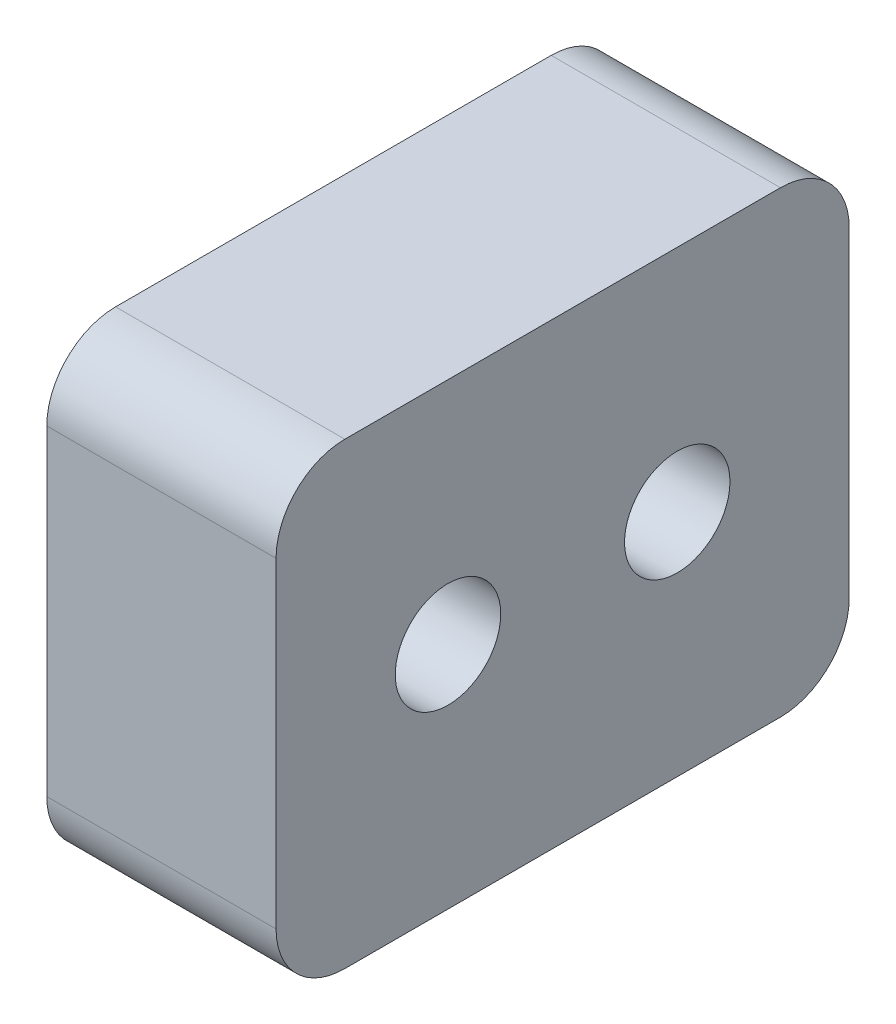
ISO-10303-21;
HEADER;
FILE_DESCRIPTION(('STEP AP214'),'2;1');
FILE_NAME('part.step','',(''),(''),'','','');
FILE_SCHEMA(('AUTOMOTIVE_DESIGN { 1 0 10303 214 1 1 1 1 }'));
ENDSEC;
DATA;
#1=APPLICATION_CONTEXT('core data for automotive mechanical design processes');
#2=APPLICATION_PROTOCOL_DEFINITION('international standard','automotive_design',2000,#1);
#3=PRODUCT_CONTEXT('',#1,'mechanical');
#4=PRODUCT('Part','Part','',(#3));
#5=PRODUCT_RELATED_PRODUCT_CATEGORY('part','',(#4));
#6=PRODUCT_DEFINITION_FORMATION('','',#4);
#7=PRODUCT_DEFINITION_CONTEXT('part definition',#1,'design');
#8=PRODUCT_DEFINITION('design','',#6,#7);
#9=PRODUCT_DEFINITION_SHAPE('','',#8);
#10=(LENGTH_UNIT() NAMED_UNIT(*) SI_UNIT(.MILLI.,.METRE.));
#11=(NAMED_UNIT(*) PLANE_ANGLE_UNIT() SI_UNIT($,.RADIAN.));
#12=(NAMED_UNIT(*) SI_UNIT($,.STERADIAN.) SOLID_ANGLE_UNIT());
#13=UNCERTAINTY_MEASURE_WITH_UNIT(LENGTH_MEASURE(1.E-05),#10,'distance_accuracy_value','');
#14=(GEOMETRIC_REPRESENTATION_CONTEXT(3) GLOBAL_UNCERTAINTY_ASSIGNED_CONTEXT((#13)) GLOBAL_UNIT_ASSIGNED_CONTEXT((#10,
#11,#12)) REPRESENTATION_CONTEXT('',''));
#15=CARTESIAN_POINT('',(0.,0.,0.));
#16=DIRECTION('',(0.,0.,1.));
#17=DIRECTION('',(1.,0.,0.));
#18=AXIS2_PLACEMENT_3D('',#15,#16,#17);
#19=CARTESIAN_POINT('',(10.,0.,0.));
#20=DIRECTION('',(-1.,0.,0.));
#21=DIRECTION('',(0.,0.,1.));
#22=AXIS2_PLACEMENT_3D('',#19,#20,#21);
#23=PLANE('',#22);
#24=DIRECTION('',(0.,-1.,0.));
#25=VECTOR('',#24,1.);
#26=CARTESIAN_POINT('',(10.,0.,0.));
#27=LINE('',#26,#25);
#28=CARTESIAN_POINT('',(10.,17.,0.));
#29=VERTEX_POINT('',#28);
#30=CARTESIAN_POINT('',(10.,3.,0.));
#31=VERTEX_POINT('',#30);
#32=EDGE_CURVE('E155',#29,#31,#27,.T.);
#33=ORIENTED_EDGE('',*,*,#32,.T.);
#34=CARTESIAN_POINT('',(10.,3.,-3.));
#35=DIRECTION('',(-1.,0.,0.));
#36=DIRECTION('',(0.,0.,1.));
#37=AXIS2_PLACEMENT_3D('',#34,#35,#36);
#38=CIRCLE('',#37,3.);
#39=CARTESIAN_POINT('',(10.,0.,-3.));
#40=VERTEX_POINT('',#39);
#41=EDGE_CURVE('E178',#31,#40,#38,.F.);
#42=ORIENTED_EDGE('',*,*,#41,.T.);
#43=DIRECTION('',(0.,0.,-1.));
#44=VECTOR('',#43,1.);
#45=CARTESIAN_POINT('',(10.,0.,0.));
#46=LINE('',#45,#44);
#47=CARTESIAN_POINT('',(10.,0.,-22.));
#48=VERTEX_POINT('',#47);
#49=EDGE_CURVE('E131',#40,#48,#46,.T.);
#50=ORIENTED_EDGE('',*,*,#49,.T.);
#51=CARTESIAN_POINT('',(10.,3.,-22.));
#52=DIRECTION('',(-1.,0.,0.));
#53=DIRECTION('',(0.,0.,1.));
#54=AXIS2_PLACEMENT_3D('',#51,#52,#53);
#55=CIRCLE('',#54,3.);
#56=CARTESIAN_POINT('',(10.,3.,-25.));
#57=VERTEX_POINT('',#56);
#58=EDGE_CURVE('E172',#48,#57,#55,.F.);
#59=ORIENTED_EDGE('',*,*,#58,.T.);
#60=DIRECTION('',(0.,1.,0.));
#61=VECTOR('',#60,1.);
#62=CARTESIAN_POINT('',(10.,0.,-25.));
#63=LINE('',#62,#61);
#64=CARTESIAN_POINT('',(10.,17.,-25.));
#65=VERTEX_POINT('',#64);
#66=EDGE_CURVE('E191',#57,#65,#63,.T.);
#67=ORIENTED_EDGE('',*,*,#66,.T.);
#68=CARTESIAN_POINT('',(10.,17.,-22.));
#69=DIRECTION('',(-1.,0.,0.));
#70=DIRECTION('',(0.,0.,1.));
#71=AXIS2_PLACEMENT_3D('',#68,#69,#70);
#72=CIRCLE('',#71,3.);
#73=CARTESIAN_POINT('',(10.,20.,-22.));
#74=VERTEX_POINT('',#73);
#75=EDGE_CURVE('E65',#65,#74,#72,.F.);
#76=ORIENTED_EDGE('',*,*,#75,.T.);
#77=DIRECTION('',(0.,0.,1.));
#78=VECTOR('',#77,1.);
#79=CARTESIAN_POINT('',(10.,20.,0.));
#80=LINE('',#79,#78);
#81=CARTESIAN_POINT('',(10.,20.,-3.));
#82=VERTEX_POINT('',#81);
#83=EDGE_CURVE('E157',#74,#82,#80,.T.);
#84=ORIENTED_EDGE('',*,*,#83,.T.);
#85=CARTESIAN_POINT('',(10.,17.,-3.));
#86=DIRECTION('',(-1.,0.,0.));
#87=DIRECTION('',(0.,0.,1.));
#88=AXIS2_PLACEMENT_3D('',#85,#86,#87);
#89=CIRCLE('',#88,3.);
#90=EDGE_CURVE('E175',#82,#29,#89,.F.);
#91=ORIENTED_EDGE('',*,*,#90,.T.);
#92=EDGE_LOOP('',(#33,#42,#50,#59,#67,#76,#84,#91));
#93=FACE_BOUND('',#92,.T.);
#94=CARTESIAN_POINT('',(10.,10.,-7.5));
#95=DIRECTION('',(1.,0.,0.));
#96=DIRECTION('',(0.,0.,-1.));
#97=AXIS2_PLACEMENT_3D('',#94,#95,#96);
#98=CIRCLE('',#97,2.3);
#99=CARTESIAN_POINT('',(10.,10.,-9.8));
#100=VERTEX_POINT('',#99);
#101=EDGE_CURVE('E149',#100,#100,#98,.T.);
#102=ORIENTED_EDGE('',*,*,#101,.F.);
#103=EDGE_LOOP('',(#102));
#104=FACE_BOUND('',#103,.T.);
#105=CARTESIAN_POINT('',(10.,10.,-17.5));
#106=DIRECTION('',(1.,0.,0.));
#107=DIRECTION('',(0.,0.,-1.));
#108=AXIS2_PLACEMENT_3D('',#105,#106,#107);
#109=CIRCLE('',#108,2.3);
#110=CARTESIAN_POINT('',(10.,10.,-19.8));
#111=VERTEX_POINT('',#110);
#112=EDGE_CURVE('E219',#111,#111,#109,.T.);
#113=ORIENTED_EDGE('',*,*,#112,.F.);
#114=EDGE_LOOP('',(#113));
#115=FACE_BOUND('',#114,.T.);
#116=ADVANCED_FACE('F42',(#93,#104,#115),#23,.F.);
#117=CARTESIAN_POINT('',(0.,0.,0.));
#118=DIRECTION('',(-1.,0.,0.));
#119=DIRECTION('',(0.,0.,1.));
#120=AXIS2_PLACEMENT_3D('',#117,#118,#119);
#121=PLANE('',#120);
#122=CARTESIAN_POINT('',(0.,10.,-7.5));
#123=DIRECTION('',(1.,0.,0.));
#124=DIRECTION('',(0.,0.,-1.));
#125=AXIS2_PLACEMENT_3D('',#122,#123,#124);
#126=CIRCLE('',#125,2.3);
#127=CARTESIAN_POINT('',(0.,10.,-9.8));
#128=VERTEX_POINT('',#127);
#129=EDGE_CURVE('E214',#128,#128,#126,.T.);
#130=ORIENTED_EDGE('',*,*,#129,.T.);
#131=EDGE_LOOP('',(#130));
#132=FACE_BOUND('',#131,.T.);
#133=DIRECTION('',(0.,0.,-1.));
#134=VECTOR('',#133,1.);
#135=CARTESIAN_POINT('',(0.,0.,0.));
#136=LINE('',#135,#134);
#137=CARTESIAN_POINT('',(0.,0.,-3.));
#138=VERTEX_POINT('',#137);
#139=CARTESIAN_POINT('',(0.,0.,-22.));
#140=VERTEX_POINT('',#139);
#141=EDGE_CURVE('E128',#138,#140,#136,.T.);
#142=ORIENTED_EDGE('',*,*,#141,.F.);
#143=CARTESIAN_POINT('',(0.,3.,-3.));
#144=DIRECTION('',(-1.,0.,0.));
#145=DIRECTION('',(0.,0.,1.));
#146=AXIS2_PLACEMENT_3D('',#143,#144,#145);
#147=CIRCLE('',#146,3.);
#148=CARTESIAN_POINT('',(0.,3.,0.));
#149=VERTEX_POINT('',#148);
#150=EDGE_CURVE('E110',#138,#149,#147,.T.);
#151=ORIENTED_EDGE('',*,*,#150,.T.);
#152=DIRECTION('',(0.,-1.,0.));
#153=VECTOR('',#152,1.);
#154=CARTESIAN_POINT('',(0.,0.,0.));
#155=LINE('',#154,#153);
#156=CARTESIAN_POINT('',(0.,17.,0.));
#157=VERTEX_POINT('',#156);
#158=EDGE_CURVE('E142',#157,#149,#155,.T.);
#159=ORIENTED_EDGE('',*,*,#158,.F.);
#160=CARTESIAN_POINT('',(0.,17.,-3.));
#161=DIRECTION('',(-1.,0.,0.));
#162=DIRECTION('',(0.,0.,1.));
#163=AXIS2_PLACEMENT_3D('',#160,#161,#162);
#164=CIRCLE('',#163,3.);
#165=CARTESIAN_POINT('',(0.,20.,-3.));
#166=VERTEX_POINT('',#165);
#167=EDGE_CURVE('E122',#157,#166,#164,.T.);
#168=ORIENTED_EDGE('',*,*,#167,.T.);
#169=DIRECTION('',(0.,0.,1.));
#170=VECTOR('',#169,1.);
#171=CARTESIAN_POINT('',(0.,20.,0.));
#172=LINE('',#171,#170);
#173=CARTESIAN_POINT('',(0.,20.,-22.));
#174=VERTEX_POINT('',#173);
#175=EDGE_CURVE('E147',#174,#166,#172,.T.);
#176=ORIENTED_EDGE('',*,*,#175,.F.);
#177=CARTESIAN_POINT('',(0.,17.,-22.));
#178=DIRECTION('',(-1.,0.,0.));
#179=DIRECTION('',(0.,0.,1.));
#180=AXIS2_PLACEMENT_3D('',#177,#178,#179);
#181=CIRCLE('',#180,3.);
#182=CARTESIAN_POINT('',(0.,17.,-25.));
#183=VERTEX_POINT('',#182);
#184=EDGE_CURVE('E133',#174,#183,#181,.T.);
#185=ORIENTED_EDGE('',*,*,#184,.T.);
#186=DIRECTION('',(0.,1.,0.));
#187=VECTOR('',#186,1.);
#188=CARTESIAN_POINT('',(0.,0.,-25.));
#189=LINE('',#188,#187);
#190=CARTESIAN_POINT('',(0.,3.,-25.));
#191=VERTEX_POINT('',#190);
#192=EDGE_CURVE('E141',#191,#183,#189,.T.);
#193=ORIENTED_EDGE('',*,*,#192,.F.);
#194=CARTESIAN_POINT('',(0.,3.,-22.));
#195=DIRECTION('',(-1.,0.,0.));
#196=DIRECTION('',(0.,0.,1.));
#197=AXIS2_PLACEMENT_3D('',#194,#195,#196);
#198=CIRCLE('',#197,3.);
#199=EDGE_CURVE('E139',#191,#140,#198,.T.);
#200=ORIENTED_EDGE('',*,*,#199,.T.);
#201=EDGE_LOOP('',(#142,#151,#159,#168,#176,#185,#193,#200));
#202=FACE_BOUND('',#201,.T.);
#203=CARTESIAN_POINT('',(0.,10.,-17.5));
#204=DIRECTION('',(1.,0.,0.));
#205=DIRECTION('',(0.,0.,-1.));
#206=AXIS2_PLACEMENT_3D('',#203,#204,#205);
#207=CIRCLE('',#206,2.3);
#208=CARTESIAN_POINT('',(0.,10.,-19.8));
#209=VERTEX_POINT('',#208);
#210=EDGE_CURVE('E223',#209,#209,#207,.T.);
#211=ORIENTED_EDGE('',*,*,#210,.T.);
#212=EDGE_LOOP('',(#211));
#213=FACE_BOUND('',#212,.T.);
#214=ADVANCED_FACE('F136',(#132,#202,#213),#121,.T.);
#215=CARTESIAN_POINT('',(10.,0.,0.));
#216=DIRECTION('',(0.,0.,-1.));
#217=DIRECTION('',(-1.,0.,0.));
#218=AXIS2_PLACEMENT_3D('',#215,#216,#217);
#219=PLANE('',#218);
#220=ORIENTED_EDGE('',*,*,#158,.T.);
#221=DIRECTION('',(-1.,0.,0.));
#222=VECTOR('',#221,1.);
#223=CARTESIAN_POINT('',(10.,3.,0.));
#224=LINE('',#223,#222);
#225=EDGE_CURVE('E115',#149,#31,#224,.F.);
#226=ORIENTED_EDGE('',*,*,#225,.T.);
#227=ORIENTED_EDGE('',*,*,#32,.F.);
#228=DIRECTION('',(-1.,0.,0.));
#229=VECTOR('',#228,1.);
#230=CARTESIAN_POINT('',(10.,17.,0.));
#231=LINE('',#230,#229);
#232=EDGE_CURVE('E121',#29,#157,#231,.T.);
#233=ORIENTED_EDGE('',*,*,#232,.T.);
#234=EDGE_LOOP('',(#220,#226,#227,#233));
#235=FACE_BOUND('',#234,.T.);
#236=ADVANCED_FACE('F208',(#235),#219,.F.);
#237=CARTESIAN_POINT('',(10.,0.,0.));
#238=DIRECTION('',(0.,1.,0.));
#239=DIRECTION('',(0.,0.,1.));
#240=AXIS2_PLACEMENT_3D('',#237,#238,#239);
#241=PLANE('',#240);
#242=ORIENTED_EDGE('',*,*,#49,.F.);
#243=DIRECTION('',(-1.,0.,0.));
#244=VECTOR('',#243,1.);
#245=CARTESIAN_POINT('',(10.,0.,-3.));
#246=LINE('',#245,#244);
#247=EDGE_CURVE('E114',#40,#138,#246,.T.);
#248=ORIENTED_EDGE('',*,*,#247,.T.);
#249=ORIENTED_EDGE('',*,*,#141,.T.);
#250=DIRECTION('',(-1.,0.,0.));
#251=VECTOR('',#250,1.);
#252=CARTESIAN_POINT('',(10.,0.,-22.));
#253=LINE('',#252,#251);
#254=EDGE_CURVE('E134',#140,#48,#253,.F.);
#255=ORIENTED_EDGE('',*,*,#254,.T.);
#256=EDGE_LOOP('',(#242,#248,#249,#255));
#257=FACE_BOUND('',#256,.T.);
#258=ADVANCED_FACE('F127',(#257),#241,.F.);
#259=CARTESIAN_POINT('',(10.,0.,-25.));
#260=DIRECTION('',(0.,0.,1.));
#261=DIRECTION('',(1.,0.,0.));
#262=AXIS2_PLACEMENT_3D('',#259,#260,#261);
#263=PLANE('',#262);
#264=ORIENTED_EDGE('',*,*,#66,.F.);
#265=DIRECTION('',(-1.,0.,0.));
#266=VECTOR('',#265,1.);
#267=CARTESIAN_POINT('',(10.,3.,-25.));
#268=LINE('',#267,#266);
#269=EDGE_CURVE('E11',#57,#191,#268,.T.);
#270=ORIENTED_EDGE('',*,*,#269,.T.);
#271=ORIENTED_EDGE('',*,*,#192,.T.);
#272=DIRECTION('',(-1.,0.,0.));
#273=VECTOR('',#272,1.);
#274=CARTESIAN_POINT('',(10.,17.,-25.));
#275=LINE('',#274,#273);
#276=EDGE_CURVE('E51',#183,#65,#275,.F.);
#277=ORIENTED_EDGE('',*,*,#276,.T.);
#278=EDGE_LOOP('',(#264,#270,#271,#277));
#279=FACE_BOUND('',#278,.T.);
#280=ADVANCED_FACE('F190',(#279),#263,.F.);
#281=CARTESIAN_POINT('',(10.,20.,0.));
#282=DIRECTION('',(0.,-1.,0.));
#283=DIRECTION('',(0.,0.,-1.));
#284=AXIS2_PLACEMENT_3D('',#281,#282,#283);
#285=PLANE('',#284);
#286=ORIENTED_EDGE('',*,*,#175,.T.);
#287=DIRECTION('',(-1.,0.,0.));
#288=VECTOR('',#287,1.);
#289=CARTESIAN_POINT('',(10.,20.,-3.));
#290=LINE('',#289,#288);
#291=EDGE_CURVE('E58',#166,#82,#290,.F.);
#292=ORIENTED_EDGE('',*,*,#291,.T.);
#293=ORIENTED_EDGE('',*,*,#83,.F.);
#294=DIRECTION('',(-1.,0.,0.));
#295=VECTOR('',#294,1.);
#296=CARTESIAN_POINT('',(10.,20.,-22.));
#297=LINE('',#296,#295);
#298=EDGE_CURVE('E181',#74,#174,#297,.T.);
#299=ORIENTED_EDGE('',*,*,#298,.T.);
#300=EDGE_LOOP('',(#286,#292,#293,#299));
#301=FACE_BOUND('',#300,.T.);
#302=ADVANCED_FACE('F201',(#301),#285,.F.);
#303=CARTESIAN_POINT('',(10.,10.,-7.5));
#304=DIRECTION('',(-1.,0.,0.));
#305=DIRECTION('',(0.,0.,1.));
#306=AXIS2_PLACEMENT_3D('',#303,#304,#305);
#307=CYLINDRICAL_SURFACE('',#306,2.3);
#308=ORIENTED_EDGE('',*,*,#101,.T.);
#309=EDGE_LOOP('',(#308));
#310=FACE_BOUND('',#309,.T.);
#311=ORIENTED_EDGE('',*,*,#129,.F.);
#312=EDGE_LOOP('',(#311));
#313=FACE_BOUND('',#312,.T.);
#314=ADVANCED_FACE('F242',(#310,#313),#307,.F.);
#315=CARTESIAN_POINT('',(10.,10.,-17.5));
#316=DIRECTION('',(-1.,0.,0.));
#317=DIRECTION('',(0.,0.,1.));
#318=AXIS2_PLACEMENT_3D('',#315,#316,#317);
#319=CYLINDRICAL_SURFACE('',#318,2.3);
#320=ORIENTED_EDGE('',*,*,#112,.T.);
#321=EDGE_LOOP('',(#320));
#322=FACE_BOUND('',#321,.T.);
#323=ORIENTED_EDGE('',*,*,#210,.F.);
#324=EDGE_LOOP('',(#323));
#325=FACE_BOUND('',#324,.T.);
#326=ADVANCED_FACE('F231',(#322,#325),#319,.F.);
#327=CARTESIAN_POINT('',(10.,3.,-3.));
#328=DIRECTION('',(-1.,0.,0.));
#329=DIRECTION('',(0.,0.,1.));
#330=AXIS2_PLACEMENT_3D('',#327,#328,#329);
#331=CYLINDRICAL_SURFACE('',#330,3.);
#332=ORIENTED_EDGE('',*,*,#41,.F.);
#333=ORIENTED_EDGE('',*,*,#225,.F.);
#334=ORIENTED_EDGE('',*,*,#150,.F.);
#335=ORIENTED_EDGE('',*,*,#247,.F.);
#336=EDGE_LOOP('',(#332,#333,#334,#335));
#337=FACE_BOUND('',#336,.T.);
#338=ADVANCED_FACE('F113',(#337),#331,.T.);
#339=CARTESIAN_POINT('',(10.,17.,-3.));
#340=DIRECTION('',(-1.,0.,0.));
#341=DIRECTION('',(0.,0.,1.));
#342=AXIS2_PLACEMENT_3D('',#339,#340,#341);
#343=CYLINDRICAL_SURFACE('',#342,3.);
#344=ORIENTED_EDGE('',*,*,#90,.F.);
#345=ORIENTED_EDGE('',*,*,#291,.F.);
#346=ORIENTED_EDGE('',*,*,#167,.F.);
#347=ORIENTED_EDGE('',*,*,#232,.F.);
#348=EDGE_LOOP('',(#344,#345,#346,#347));
#349=FACE_BOUND('',#348,.T.);
#350=ADVANCED_FACE('F205',(#349),#343,.T.);
#351=CARTESIAN_POINT('',(10.,3.,-22.));
#352=DIRECTION('',(-1.,0.,0.));
#353=DIRECTION('',(0.,0.,1.));
#354=AXIS2_PLACEMENT_3D('',#351,#352,#353);
#355=CYLINDRICAL_SURFACE('',#354,3.);
#356=ORIENTED_EDGE('',*,*,#58,.F.);
#357=ORIENTED_EDGE('',*,*,#254,.F.);
#358=ORIENTED_EDGE('',*,*,#199,.F.);
#359=ORIENTED_EDGE('',*,*,#269,.F.);
#360=EDGE_LOOP('',(#356,#357,#358,#359));
#361=FACE_BOUND('',#360,.T.);
#362=ADVANCED_FACE('F256',(#361),#355,.T.);
#363=CARTESIAN_POINT('',(10.,17.,-22.));
#364=DIRECTION('',(-1.,0.,0.));
#365=DIRECTION('',(0.,0.,1.));
#366=AXIS2_PLACEMENT_3D('',#363,#364,#365);
#367=CYLINDRICAL_SURFACE('',#366,3.);
#368=ORIENTED_EDGE('',*,*,#75,.F.);
#369=ORIENTED_EDGE('',*,*,#276,.F.);
#370=ORIENTED_EDGE('',*,*,#184,.F.);
#371=ORIENTED_EDGE('',*,*,#298,.F.);
#372=EDGE_LOOP('',(#368,#369,#370,#371));
#373=FACE_BOUND('',#372,.T.);
#374=ADVANCED_FACE('F44',(#373),#367,.T.);
#375=CLOSED_SHELL('',(#116,#214,#236,#258,#280,#302,#314,#326,#338,#350,#362,#374));
#376=MANIFOLD_SOLID_BREP('B2',#375);
#377=ADVANCED_BREP_SHAPE_REPRESENTATION('',(#18,#376),#14);
#378=SHAPE_DEFINITION_REPRESENTATION(#9,#377);
ENDSEC;
END-ISO-10303-21;
